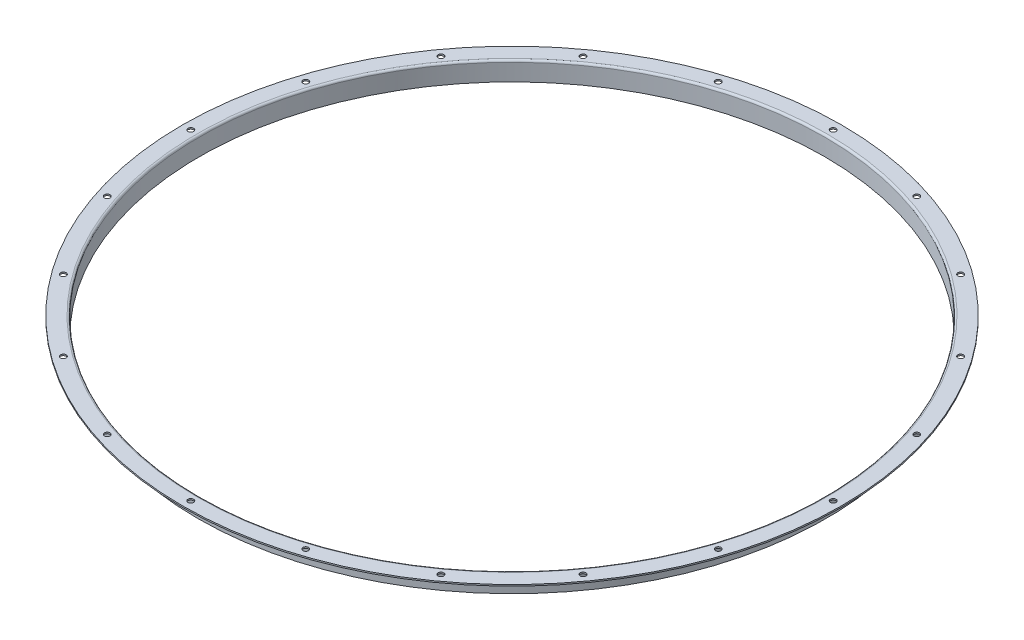
ISO-10303-21;
HEADER;
FILE_DESCRIPTION(('STEP AP214'),'2;1');
FILE_NAME('part.step','',(''),(''),'','','');
FILE_SCHEMA(('AUTOMOTIVE_DESIGN { 1 0 10303 214 1 1 1 1 }'));
ENDSEC;
DATA;
#1=APPLICATION_CONTEXT('core data for automotive mechanical design processes');
#2=APPLICATION_PROTOCOL_DEFINITION('international standard','automotive_design',2000,#1);
#3=PRODUCT_CONTEXT('',#1,'mechanical');
#4=PRODUCT('Part','Part','',(#3));
#5=PRODUCT_RELATED_PRODUCT_CATEGORY('part','',(#4));
#6=PRODUCT_DEFINITION_FORMATION('','',#4);
#7=PRODUCT_DEFINITION_CONTEXT('part definition',#1,'design');
#8=PRODUCT_DEFINITION('design','',#6,#7);
#9=PRODUCT_DEFINITION_SHAPE('','',#8);
#10=(LENGTH_UNIT() NAMED_UNIT(*) SI_UNIT(.MILLI.,.METRE.));
#11=(NAMED_UNIT(*) PLANE_ANGLE_UNIT() SI_UNIT($,.RADIAN.));
#12=(NAMED_UNIT(*) SI_UNIT($,.STERADIAN.) SOLID_ANGLE_UNIT());
#13=UNCERTAINTY_MEASURE_WITH_UNIT(LENGTH_MEASURE(1.E-05),#10,'distance_accuracy_value','');
#14=(GEOMETRIC_REPRESENTATION_CONTEXT(3) GLOBAL_UNCERTAINTY_ASSIGNED_CONTEXT((#13)) GLOBAL_UNIT_ASSIGNED_CONTEXT((#10,
#11,#12)) REPRESENTATION_CONTEXT('',''));
#15=CARTESIAN_POINT('',(0.,0.,0.));
#16=DIRECTION('',(0.,0.,1.));
#17=DIRECTION('',(1.,0.,0.));
#18=AXIS2_PLACEMENT_3D('',#15,#16,#17);
#19=CARTESIAN_POINT('',(0.,-2.5,0.));
#20=DIRECTION('',(0.,1.,0.));
#21=DIRECTION('',(0.,0.,1.));
#22=AXIS2_PLACEMENT_3D('',#19,#20,#21);
#23=PLANE('',#22);
#24=CARTESIAN_POINT('',(-567.499999999978,-2.5,3.22586402035085E-11));
#25=DIRECTION('',(0.,1.,0.));
#26=DIRECTION('',(0.,0.,1.));
#27=AXIS2_PLACEMENT_3D('',#24,#25,#26);
#28=CIRCLE('',#27,5.00000000005728);
#29=CARTESIAN_POINT('',(-567.499999999978,-2.5,5.00000000008954));
#30=VERTEX_POINT('',#29);
#31=EDGE_CURVE('E139',#30,#30,#28,.T.);
#32=ORIENTED_EDGE('',*,*,#31,.T.);
#33=EDGE_LOOP('',(#32));
#34=FACE_BOUND('',#33,.T.);
#35=CARTESIAN_POINT('',(-539.724572997467,-2.5,175.367144307813));
#36=DIRECTION('',(0.,1.,0.));
#37=DIRECTION('',(0.,0.,1.));
#38=AXIS2_PLACEMENT_3D('',#35,#36,#37);
#39=CIRCLE('',#38,5.00000000005728);
#40=CARTESIAN_POINT('',(-539.724572997467,-2.5,180.367144307871));
#41=VERTEX_POINT('',#40);
#42=EDGE_CURVE('E327',#41,#41,#39,.T.);
#43=ORIENTED_EDGE('',*,*,#42,.T.);
#44=EDGE_LOOP('',(#43));
#45=FACE_BOUND('',#44,.T.);
#46=CARTESIAN_POINT('',(-459.117144307741,-2.5,333.568130676005));
#47=DIRECTION('',(0.,1.,0.));
#48=DIRECTION('',(0.,0.,1.));
#49=AXIS2_PLACEMENT_3D('',#46,#47,#48);
#50=CIRCLE('',#49,5.00000000005729);
#51=CARTESIAN_POINT('',(-459.117144307741,-2.5,338.568130676062));
#52=VERTEX_POINT('',#51);
#53=EDGE_CURVE('E325',#52,#52,#50,.T.);
#54=ORIENTED_EDGE('',*,*,#53,.T.);
#55=EDGE_LOOP('',(#54));
#56=FACE_BOUND('',#55,.T.);
#57=CARTESIAN_POINT('',(-333.56813067593,-2.5,459.117144307802));
#58=DIRECTION('',(0.,1.,0.));
#59=DIRECTION('',(0.,0.,1.));
#60=AXIS2_PLACEMENT_3D('',#57,#58,#59);
#61=CIRCLE('',#60,5.00000000005729);
#62=CARTESIAN_POINT('',(-333.56813067593,-2.5,464.117144307859));
#63=VERTEX_POINT('',#62);
#64=EDGE_CURVE('E322',#63,#63,#61,.T.);
#65=ORIENTED_EDGE('',*,*,#64,.T.);
#66=EDGE_LOOP('',(#65));
#67=FACE_BOUND('',#66,.T.);
#68=CARTESIAN_POINT('',(-175.36714430773,-2.5,539.72457299751));
#69=DIRECTION('',(0.,1.,0.));
#70=DIRECTION('',(0.,0.,1.));
#71=AXIS2_PLACEMENT_3D('',#68,#69,#70);
#72=CIRCLE('',#71,5.00000000005729);
#73=CARTESIAN_POINT('',(-175.36714430773,-2.5,544.724572997567));
#74=VERTEX_POINT('',#73);
#75=EDGE_CURVE('E319',#74,#74,#72,.T.);
#76=ORIENTED_EDGE('',*,*,#75,.T.);
#77=EDGE_LOOP('',(#76));
#78=FACE_BOUND('',#77,.T.);
#79=CARTESIAN_POINT('',(5.45478212559115E-11,-2.5,567.5));
#80=DIRECTION('',(0.,1.,0.));
#81=DIRECTION('',(0.,0.,1.));
#82=AXIS2_PLACEMENT_3D('',#79,#80,#81);
#83=CIRCLE('',#82,5.00000000005729);
#84=CARTESIAN_POINT('',(5.45478212559115E-11,-2.5,572.500000000057));
#85=VERTEX_POINT('',#84);
#86=EDGE_CURVE('E316',#85,#85,#83,.T.);
#87=ORIENTED_EDGE('',*,*,#86,.T.);
#88=EDGE_LOOP('',(#87));
#89=FACE_BOUND('',#88,.T.);
#90=CARTESIAN_POINT('',(175.367144307836,-2.5,539.72457299749));
#91=DIRECTION('',(0.,1.,0.));
#92=DIRECTION('',(0.,0.,1.));
#93=AXIS2_PLACEMENT_3D('',#90,#91,#92);
#94=CIRCLE('',#93,5.00000000005729);
#95=CARTESIAN_POINT('',(175.367144307836,-2.5,544.724572997547));
#96=VERTEX_POINT('',#95);
#97=EDGE_CURVE('E313',#96,#96,#94,.T.);
#98=ORIENTED_EDGE('',*,*,#97,.T.);
#99=EDGE_LOOP('',(#98));
#100=FACE_BOUND('',#99,.T.);
#101=CARTESIAN_POINT('',(333.568130676027,-2.5,459.117144307764));
#102=DIRECTION('',(0.,1.,0.));
#103=DIRECTION('',(0.,0.,1.));
#104=AXIS2_PLACEMENT_3D('',#101,#102,#103);
#105=CIRCLE('',#104,5.00000000005729);
#106=CARTESIAN_POINT('',(333.568130676027,-2.5,464.117144307821));
#107=VERTEX_POINT('',#106);
#108=EDGE_CURVE('E310',#107,#107,#105,.T.);
#109=ORIENTED_EDGE('',*,*,#108,.T.);
#110=EDGE_LOOP('',(#109));
#111=FACE_BOUND('',#110,.T.);
#112=CARTESIAN_POINT('',(459.117144307824,-2.5,333.568130675953));
#113=DIRECTION('',(0.,1.,0.));
#114=DIRECTION('',(0.,0.,1.));
#115=AXIS2_PLACEMENT_3D('',#112,#113,#114);
#116=CIRCLE('',#115,5.00000000005729);
#117=CARTESIAN_POINT('',(459.117144307824,-2.5,338.56813067601));
#118=VERTEX_POINT('',#117);
#119=EDGE_CURVE('E307',#118,#118,#116,.T.);
#120=ORIENTED_EDGE('',*,*,#119,.T.);
#121=EDGE_LOOP('',(#120));
#122=FACE_BOUND('',#121,.T.);
#123=CARTESIAN_POINT('',(539.724572997532,-2.5,175.367144307752));
#124=DIRECTION('',(0.,1.,0.));
#125=DIRECTION('',(0.,0.,1.));
#126=AXIS2_PLACEMENT_3D('',#123,#124,#125);
#127=CIRCLE('',#126,5.00000000005728);
#128=CARTESIAN_POINT('',(539.724572997532,-2.5,180.367144307809));
#129=VERTEX_POINT('',#128);
#130=EDGE_CURVE('E304',#129,#129,#127,.T.);
#131=ORIENTED_EDGE('',*,*,#130,.T.);
#132=EDGE_LOOP('',(#131));
#133=FACE_BOUND('',#132,.T.);
#134=CARTESIAN_POINT('',(567.500000000022,-2.5,-3.21891414976569E-11));
#135=DIRECTION('',(0.,1.,0.));
#136=DIRECTION('',(0.,0.,1.));
#137=AXIS2_PLACEMENT_3D('',#134,#135,#136);
#138=CIRCLE('',#137,5.00000000005728);
#139=CARTESIAN_POINT('',(567.500000000022,-2.5,5.00000000002509));
#140=VERTEX_POINT('',#139);
#141=EDGE_CURVE('E301',#140,#140,#138,.T.);
#142=ORIENTED_EDGE('',*,*,#141,.T.);
#143=EDGE_LOOP('',(#142));
#144=FACE_BOUND('',#143,.T.);
#145=CARTESIAN_POINT('',(539.724572997512,-2.5,-175.367144307813));
#146=DIRECTION('',(0.,1.,0.));
#147=DIRECTION('',(0.,0.,1.));
#148=AXIS2_PLACEMENT_3D('',#145,#146,#147);
#149=CIRCLE('',#148,5.00000000005728);
#150=CARTESIAN_POINT('',(539.724572997512,-2.5,-170.367144307756));
#151=VERTEX_POINT('',#150);
#152=EDGE_CURVE('E298',#151,#151,#149,.T.);
#153=ORIENTED_EDGE('',*,*,#152,.T.);
#154=EDGE_LOOP('',(#153));
#155=FACE_BOUND('',#154,.T.);
#156=CARTESIAN_POINT('',(175.367144307774,-2.5,-539.72457299751));
#157=DIRECTION('',(0.,1.,0.));
#158=DIRECTION('',(0.,0.,1.));
#159=AXIS2_PLACEMENT_3D('',#156,#157,#158);
#160=CIRCLE('',#159,5.00000000005729);
#161=CARTESIAN_POINT('',(175.367144307774,-2.5,-534.724572997452));
#162=VERTEX_POINT('',#161);
#163=EDGE_CURVE('E295',#162,#162,#160,.T.);
#164=ORIENTED_EDGE('',*,*,#163,.T.);
#165=EDGE_LOOP('',(#164));
#166=FACE_BOUND('',#165,.T.);
#167=CARTESIAN_POINT('',(333.568130675975,-2.5,-459.117144307802));
#168=DIRECTION('',(0.,1.,0.));
#169=DIRECTION('',(0.,0.,1.));
#170=AXIS2_PLACEMENT_3D('',#167,#168,#169);
#171=CIRCLE('',#170,5.00000000005729);
#172=CARTESIAN_POINT('',(333.568130675975,-2.5,-454.117144307744));
#173=VERTEX_POINT('',#172);
#174=EDGE_CURVE('E292',#173,#173,#171,.T.);
#175=ORIENTED_EDGE('',*,*,#174,.T.);
#176=EDGE_LOOP('',(#175));
#177=FACE_BOUND('',#176,.T.);
#178=CARTESIAN_POINT('',(-9.83046173940238E-12,-2.5,-567.5));
#179=DIRECTION('',(0.,1.,0.));
#180=DIRECTION('',(0.,0.,1.));
#181=AXIS2_PLACEMENT_3D('',#178,#179,#180);
#182=CIRCLE('',#181,5.00000000005729);
#183=CARTESIAN_POINT('',(-9.83046173940238E-12,-2.5,-562.499999999943));
#184=VERTEX_POINT('',#183);
#185=EDGE_CURVE('E283',#184,#184,#182,.T.);
#186=ORIENTED_EDGE('',*,*,#185,.T.);
#187=EDGE_LOOP('',(#186));
#188=FACE_BOUND('',#187,.T.);
#189=CARTESIAN_POINT('',(459.117144307786,-2.5,-333.568130676005));
#190=DIRECTION('',(0.,1.,0.));
#191=DIRECTION('',(0.,0.,1.));
#192=AXIS2_PLACEMENT_3D('',#189,#190,#191);
#193=CIRCLE('',#192,5.00000000005729);
#194=CARTESIAN_POINT('',(459.117144307786,-2.5,-328.568130675947));
#195=VERTEX_POINT('',#194);
#196=EDGE_CURVE('E279',#195,#195,#193,.T.);
#197=ORIENTED_EDGE('',*,*,#196,.T.);
#198=EDGE_LOOP('',(#197));
#199=FACE_BOUND('',#198,.T.);
#200=CARTESIAN_POINT('',(-459.117144307779,-2.5,-333.568130675952));
#201=DIRECTION('',(0.,1.,0.));
#202=DIRECTION('',(0.,0.,1.));
#203=AXIS2_PLACEMENT_3D('',#200,#201,#202);
#204=CIRCLE('',#203,5.00000000005729);
#205=CARTESIAN_POINT('',(-459.117144307779,-2.5,-328.568130675895));
#206=VERTEX_POINT('',#205);
#207=EDGE_CURVE('E277',#206,#206,#204,.T.);
#208=ORIENTED_EDGE('',*,*,#207,.T.);
#209=EDGE_LOOP('',(#208));
#210=FACE_BOUND('',#209,.T.);
#211=CARTESIAN_POINT('',(-333.568130675982,-2.5,-459.117144307764));
#212=DIRECTION('',(0.,1.,0.));
#213=DIRECTION('',(0.,0.,1.));
#214=AXIS2_PLACEMENT_3D('',#211,#212,#213);
#215=CIRCLE('',#214,5.00000000005729);
#216=CARTESIAN_POINT('',(-333.568130675982,-2.5,-454.117144307706));
#217=VERTEX_POINT('',#216);
#218=EDGE_CURVE('E280',#217,#217,#215,.T.);
#219=ORIENTED_EDGE('',*,*,#218,.T.);
#220=EDGE_LOOP('',(#219));
#221=FACE_BOUND('',#220,.T.);
#222=CARTESIAN_POINT('',(-175.367144307791,-2.5,-539.72457299749));
#223=DIRECTION('',(0.,1.,0.));
#224=DIRECTION('',(0.,0.,1.));
#225=AXIS2_PLACEMENT_3D('',#222,#223,#224);
#226=CIRCLE('',#225,5.00000000005729);
#227=CARTESIAN_POINT('',(-175.367144307791,-2.5,-534.724572997432));
#228=VERTEX_POINT('',#227);
#229=EDGE_CURVE('E286',#228,#228,#226,.T.);
#230=ORIENTED_EDGE('',*,*,#229,.T.);
#231=EDGE_LOOP('',(#230));
#232=FACE_BOUND('',#231,.T.);
#233=CARTESIAN_POINT('',(-539.724572997487,-2.5,-175.367144307752));
#234=DIRECTION('',(0.,1.,0.));
#235=DIRECTION('',(0.,0.,1.));
#236=AXIS2_PLACEMENT_3D('',#233,#234,#235);
#237=CIRCLE('',#236,5.00000000005926);
#238=CARTESIAN_POINT('',(-539.724572997487,-2.5,-170.367144307693));
#239=VERTEX_POINT('',#238);
#240=EDGE_CURVE('E370',#239,#239,#237,.T.);
#241=ORIENTED_EDGE('',*,*,#240,.T.);
#242=EDGE_LOOP('',(#241));
#243=FACE_BOUND('',#242,.T.);
#244=CARTESIAN_POINT('',(0.,-2.5,0.));
#245=DIRECTION('',(0.,1.,0.));
#246=DIRECTION('',(0.,0.,1.));
#247=AXIS2_PLACEMENT_3D('',#244,#245,#246);
#248=CIRCLE('',#247,582.5);
#249=CARTESIAN_POINT('',(0.,-2.5,582.5));
#250=VERTEX_POINT('',#249);
#251=EDGE_CURVE('E96',#250,#250,#248,.T.);
#252=ORIENTED_EDGE('',*,*,#251,.F.);
#253=EDGE_LOOP('',(#252));
#254=FACE_BOUND('',#253,.T.);
#255=CARTESIAN_POINT('',(0.,-2.5,0.));
#256=DIRECTION('',(0.,1.,0.));
#257=DIRECTION('',(0.,0.,1.));
#258=AXIS2_PLACEMENT_3D('',#255,#256,#257);
#259=CIRCLE('',#258,556.);
#260=CARTESIAN_POINT('',(0.,-2.5,556.));
#261=VERTEX_POINT('',#260);
#262=EDGE_CURVE('E12',#261,#261,#259,.F.);
#263=ORIENTED_EDGE('',*,*,#262,.F.);
#264=EDGE_LOOP('',(#263));
#265=FACE_BOUND('',#264,.T.);
#266=ADVANCED_FACE('F88',(#34,#45,#56,#67,#78,#89,#100,#111,#122,#133,#144,#155,#166,#177,#188,
#199,#210,#221,#232,#243,#254,#265),#23,.F.);
#267=CARTESIAN_POINT('',(0.,0.,0.));
#268=DIRECTION('',(0.,1.,0.));
#269=DIRECTION('',(0.,0.,1.));
#270=AXIS2_PLACEMENT_3D('',#267,#268,#269);
#271=PLANE('',#270);
#272=CARTESIAN_POINT('',(-567.499999999978,0.,3.22586402035085E-11));
#273=DIRECTION('',(0.,1.,0.));
#274=DIRECTION('',(0.,0.,1.));
#275=AXIS2_PLACEMENT_3D('',#272,#273,#274);
#276=CIRCLE('',#275,5.00000000005728);
#277=CARTESIAN_POINT('',(-567.499999999978,0.,5.00000000008954));
#278=VERTEX_POINT('',#277);
#279=EDGE_CURVE('E403',#278,#278,#276,.T.);
#280=ORIENTED_EDGE('',*,*,#279,.F.);
#281=EDGE_LOOP('',(#280));
#282=FACE_BOUND('',#281,.T.);
#283=CARTESIAN_POINT('',(-539.724572997467,0.,175.367144307813));
#284=DIRECTION('',(0.,1.,0.));
#285=DIRECTION('',(0.,0.,1.));
#286=AXIS2_PLACEMENT_3D('',#283,#284,#285);
#287=CIRCLE('',#286,5.00000000005728);
#288=CARTESIAN_POINT('',(-539.724572997467,0.,180.367144307871));
#289=VERTEX_POINT('',#288);
#290=EDGE_CURVE('E406',#289,#289,#287,.T.);
#291=ORIENTED_EDGE('',*,*,#290,.F.);
#292=EDGE_LOOP('',(#291));
#293=FACE_BOUND('',#292,.T.);
#294=CARTESIAN_POINT('',(-459.117144307741,0.,333.568130676005));
#295=DIRECTION('',(0.,1.,0.));
#296=DIRECTION('',(0.,0.,1.));
#297=AXIS2_PLACEMENT_3D('',#294,#295,#296);
#298=CIRCLE('',#297,5.00000000005729);
#299=CARTESIAN_POINT('',(-459.117144307741,0.,338.568130676062));
#300=VERTEX_POINT('',#299);
#301=EDGE_CURVE('E409',#300,#300,#298,.T.);
#302=ORIENTED_EDGE('',*,*,#301,.F.);
#303=EDGE_LOOP('',(#302));
#304=FACE_BOUND('',#303,.T.);
#305=CARTESIAN_POINT('',(-333.56813067593,0.,459.117144307802));
#306=DIRECTION('',(0.,1.,0.));
#307=DIRECTION('',(0.,0.,1.));
#308=AXIS2_PLACEMENT_3D('',#305,#306,#307);
#309=CIRCLE('',#308,5.00000000005729);
#310=CARTESIAN_POINT('',(-333.56813067593,0.,464.117144307859));
#311=VERTEX_POINT('',#310);
#312=EDGE_CURVE('E412',#311,#311,#309,.T.);
#313=ORIENTED_EDGE('',*,*,#312,.F.);
#314=EDGE_LOOP('',(#313));
#315=FACE_BOUND('',#314,.T.);
#316=CARTESIAN_POINT('',(-175.36714430773,0.,539.72457299751));
#317=DIRECTION('',(0.,1.,0.));
#318=DIRECTION('',(0.,0.,1.));
#319=AXIS2_PLACEMENT_3D('',#316,#317,#318);
#320=CIRCLE('',#319,5.00000000005729);
#321=CARTESIAN_POINT('',(-175.36714430773,0.,544.724572997567));
#322=VERTEX_POINT('',#321);
#323=EDGE_CURVE('E415',#322,#322,#320,.T.);
#324=ORIENTED_EDGE('',*,*,#323,.F.);
#325=EDGE_LOOP('',(#324));
#326=FACE_BOUND('',#325,.T.);
#327=CARTESIAN_POINT('',(5.45478212559115E-11,0.,567.5));
#328=DIRECTION('',(0.,1.,0.));
#329=DIRECTION('',(0.,0.,1.));
#330=AXIS2_PLACEMENT_3D('',#327,#328,#329);
#331=CIRCLE('',#330,5.00000000005729);
#332=CARTESIAN_POINT('',(5.45478212559115E-11,0.,572.500000000057));
#333=VERTEX_POINT('',#332);
#334=EDGE_CURVE('E418',#333,#333,#331,.T.);
#335=ORIENTED_EDGE('',*,*,#334,.F.);
#336=EDGE_LOOP('',(#335));
#337=FACE_BOUND('',#336,.T.);
#338=CARTESIAN_POINT('',(175.367144307836,0.,539.72457299749));
#339=DIRECTION('',(0.,1.,0.));
#340=DIRECTION('',(0.,0.,1.));
#341=AXIS2_PLACEMENT_3D('',#338,#339,#340);
#342=CIRCLE('',#341,5.00000000005729);
#343=CARTESIAN_POINT('',(175.367144307836,0.,544.724572997547));
#344=VERTEX_POINT('',#343);
#345=EDGE_CURVE('E421',#344,#344,#342,.T.);
#346=ORIENTED_EDGE('',*,*,#345,.F.);
#347=EDGE_LOOP('',(#346));
#348=FACE_BOUND('',#347,.T.);
#349=CARTESIAN_POINT('',(333.568130676027,0.,459.117144307764));
#350=DIRECTION('',(0.,1.,0.));
#351=DIRECTION('',(0.,0.,1.));
#352=AXIS2_PLACEMENT_3D('',#349,#350,#351);
#353=CIRCLE('',#352,5.00000000005729);
#354=CARTESIAN_POINT('',(333.568130676027,0.,464.117144307821));
#355=VERTEX_POINT('',#354);
#356=EDGE_CURVE('E383',#355,#355,#353,.T.);
#357=ORIENTED_EDGE('',*,*,#356,.F.);
#358=EDGE_LOOP('',(#357));
#359=FACE_BOUND('',#358,.T.);
#360=CARTESIAN_POINT('',(459.117144307824,0.,333.568130675953));
#361=DIRECTION('',(0.,1.,0.));
#362=DIRECTION('',(0.,0.,1.));
#363=AXIS2_PLACEMENT_3D('',#360,#361,#362);
#364=CIRCLE('',#363,5.00000000005729);
#365=CARTESIAN_POINT('',(459.117144307824,0.,338.56813067601));
#366=VERTEX_POINT('',#365);
#367=EDGE_CURVE('E379',#366,#366,#364,.T.);
#368=ORIENTED_EDGE('',*,*,#367,.F.);
#369=EDGE_LOOP('',(#368));
#370=FACE_BOUND('',#369,.T.);
#371=CARTESIAN_POINT('',(539.724572997532,0.,175.367144307752));
#372=DIRECTION('',(0.,1.,0.));
#373=DIRECTION('',(0.,0.,1.));
#374=AXIS2_PLACEMENT_3D('',#371,#372,#373);
#375=CIRCLE('',#374,5.00000000005728);
#376=CARTESIAN_POINT('',(539.724572997532,0.,180.367144307809));
#377=VERTEX_POINT('',#376);
#378=EDGE_CURVE('E382',#377,#377,#375,.T.);
#379=ORIENTED_EDGE('',*,*,#378,.F.);
#380=EDGE_LOOP('',(#379));
#381=FACE_BOUND('',#380,.T.);
#382=CARTESIAN_POINT('',(567.500000000022,0.,-3.21891414976569E-11));
#383=DIRECTION('',(0.,1.,0.));
#384=DIRECTION('',(0.,0.,1.));
#385=AXIS2_PLACEMENT_3D('',#382,#383,#384);
#386=CIRCLE('',#385,5.00000000005728);
#387=CARTESIAN_POINT('',(567.500000000022,0.,5.00000000002509));
#388=VERTEX_POINT('',#387);
#389=EDGE_CURVE('E386',#388,#388,#386,.T.);
#390=ORIENTED_EDGE('',*,*,#389,.F.);
#391=EDGE_LOOP('',(#390));
#392=FACE_BOUND('',#391,.T.);
#393=CARTESIAN_POINT('',(539.724572997512,0.,-175.367144307813));
#394=DIRECTION('',(0.,1.,0.));
#395=DIRECTION('',(0.,0.,1.));
#396=AXIS2_PLACEMENT_3D('',#393,#394,#395);
#397=CIRCLE('',#396,5.00000000005728);
#398=CARTESIAN_POINT('',(539.724572997512,0.,-170.367144307756));
#399=VERTEX_POINT('',#398);
#400=EDGE_CURVE('E389',#399,#399,#397,.T.);
#401=ORIENTED_EDGE('',*,*,#400,.F.);
#402=EDGE_LOOP('',(#401));
#403=FACE_BOUND('',#402,.T.);
#404=CARTESIAN_POINT('',(175.367144307774,0.,-539.72457299751));
#405=DIRECTION('',(0.,1.,0.));
#406=DIRECTION('',(0.,0.,1.));
#407=AXIS2_PLACEMENT_3D('',#404,#405,#406);
#408=CIRCLE('',#407,5.00000000005729);
#409=CARTESIAN_POINT('',(175.367144307774,0.,-534.724572997452));
#410=VERTEX_POINT('',#409);
#411=EDGE_CURVE('E376',#410,#410,#408,.T.);
#412=ORIENTED_EDGE('',*,*,#411,.F.);
#413=EDGE_LOOP('',(#412));
#414=FACE_BOUND('',#413,.T.);
#415=CARTESIAN_POINT('',(333.568130675975,0.,-459.117144307802));
#416=DIRECTION('',(0.,1.,0.));
#417=DIRECTION('',(0.,0.,1.));
#418=AXIS2_PLACEMENT_3D('',#415,#416,#417);
#419=CIRCLE('',#418,5.00000000005729);
#420=CARTESIAN_POINT('',(333.568130675975,0.,-454.117144307744));
#421=VERTEX_POINT('',#420);
#422=EDGE_CURVE('E393',#421,#421,#419,.T.);
#423=ORIENTED_EDGE('',*,*,#422,.F.);
#424=EDGE_LOOP('',(#423));
#425=FACE_BOUND('',#424,.T.);
#426=CARTESIAN_POINT('',(-9.83046173940238E-12,0.,-567.5));
#427=DIRECTION('',(0.,1.,0.));
#428=DIRECTION('',(0.,0.,1.));
#429=AXIS2_PLACEMENT_3D('',#426,#427,#428);
#430=CIRCLE('',#429,5.00000000005729);
#431=CARTESIAN_POINT('',(-9.83046173940238E-12,0.,-562.499999999943));
#432=VERTEX_POINT('',#431);
#433=EDGE_CURVE('E396',#432,#432,#430,.T.);
#434=ORIENTED_EDGE('',*,*,#433,.F.);
#435=EDGE_LOOP('',(#434));
#436=FACE_BOUND('',#435,.T.);
#437=CARTESIAN_POINT('',(459.117144307786,0.,-333.568130676005));
#438=DIRECTION('',(0.,1.,0.));
#439=DIRECTION('',(0.,0.,1.));
#440=AXIS2_PLACEMENT_3D('',#437,#438,#439);
#441=CIRCLE('',#440,5.00000000005729);
#442=CARTESIAN_POINT('',(459.117144307786,0.,-328.568130675947));
#443=VERTEX_POINT('',#442);
#444=EDGE_CURVE('E392',#443,#443,#441,.T.);
#445=ORIENTED_EDGE('',*,*,#444,.F.);
#446=EDGE_LOOP('',(#445));
#447=FACE_BOUND('',#446,.T.);
#448=CARTESIAN_POINT('',(-459.117144307779,0.,-333.568130675952));
#449=DIRECTION('',(0.,1.,0.));
#450=DIRECTION('',(0.,0.,1.));
#451=AXIS2_PLACEMENT_3D('',#448,#449,#450);
#452=CIRCLE('',#451,5.00000000005729);
#453=CARTESIAN_POINT('',(-459.117144307779,0.,-328.568130675895));
#454=VERTEX_POINT('',#453);
#455=EDGE_CURVE('E274',#454,#454,#452,.T.);
#456=ORIENTED_EDGE('',*,*,#455,.F.);
#457=EDGE_LOOP('',(#456));
#458=FACE_BOUND('',#457,.T.);
#459=CARTESIAN_POINT('',(-333.568130675982,0.,-459.117144307764));
#460=DIRECTION('',(0.,1.,0.));
#461=DIRECTION('',(0.,0.,1.));
#462=AXIS2_PLACEMENT_3D('',#459,#460,#461);
#463=CIRCLE('',#462,5.00000000005729);
#464=CARTESIAN_POINT('',(-333.568130675982,0.,-454.117144307706));
#465=VERTEX_POINT('',#464);
#466=EDGE_CURVE('E429',#465,#465,#463,.T.);
#467=ORIENTED_EDGE('',*,*,#466,.F.);
#468=EDGE_LOOP('',(#467));
#469=FACE_BOUND('',#468,.T.);
#470=CARTESIAN_POINT('',(-175.367144307791,0.,-539.72457299749));
#471=DIRECTION('',(0.,1.,0.));
#472=DIRECTION('',(0.,0.,1.));
#473=AXIS2_PLACEMENT_3D('',#470,#471,#472);
#474=CIRCLE('',#473,5.00000000005729);
#475=CARTESIAN_POINT('',(-175.367144307791,0.,-534.724572997432));
#476=VERTEX_POINT('',#475);
#477=EDGE_CURVE('E426',#476,#476,#474,.T.);
#478=ORIENTED_EDGE('',*,*,#477,.F.);
#479=EDGE_LOOP('',(#478));
#480=FACE_BOUND('',#479,.T.);
#481=CARTESIAN_POINT('',(-539.724572997487,0.,-175.367144307752));
#482=DIRECTION('',(0.,1.,0.));
#483=DIRECTION('',(0.,0.,1.));
#484=AXIS2_PLACEMENT_3D('',#481,#482,#483);
#485=CIRCLE('',#484,5.00000000005926);
#486=CARTESIAN_POINT('',(-539.724572997487,0.,-170.367144307693));
#487=VERTEX_POINT('',#486);
#488=EDGE_CURVE('E373',#487,#487,#485,.T.);
#489=ORIENTED_EDGE('',*,*,#488,.F.);
#490=EDGE_LOOP('',(#489));
#491=FACE_BOUND('',#490,.T.);
#492=CARTESIAN_POINT('',(0.,0.,0.));
#493=DIRECTION('',(0.,1.,0.));
#494=DIRECTION('',(0.,0.,1.));
#495=AXIS2_PLACEMENT_3D('',#492,#493,#494);
#496=CIRCLE('',#495,582.5);
#497=CARTESIAN_POINT('',(0.,0.,582.5));
#498=VERTEX_POINT('',#497);
#499=EDGE_CURVE('E152',#498,#498,#496,.T.);
#500=ORIENTED_EDGE('',*,*,#499,.T.);
#501=EDGE_LOOP('',(#500));
#502=FACE_BOUND('',#501,.T.);
#503=CARTESIAN_POINT('',(0.,0.,0.));
#504=DIRECTION('',(0.,1.,0.));
#505=DIRECTION('',(0.,0.,1.));
#506=AXIS2_PLACEMENT_3D('',#503,#504,#505);
#507=CIRCLE('',#506,556.);
#508=CARTESIAN_POINT('',(0.,0.,556.));
#509=VERTEX_POINT('',#508);
#510=EDGE_CURVE('E103',#509,#509,#507,.T.);
#511=ORIENTED_EDGE('',*,*,#510,.F.);
#512=EDGE_LOOP('',(#511));
#513=FACE_BOUND('',#512,.T.);
#514=ADVANCED_FACE('F157',(#282,#293,#304,#315,#326,#337,#348,#359,#370,#381,#392,#403,#414,
#425,#436,#447,#458,#469,#480,#491,#502,#513),#271,.T.);
#515=CARTESIAN_POINT('',(0.,-2.5,0.));
#516=DIRECTION('',(0.,1.,0.));
#517=DIRECTION('',(0.,0.,1.));
#518=AXIS2_PLACEMENT_3D('',#515,#516,#517);
#519=CYLINDRICAL_SURFACE('',#518,582.5);
#520=ORIENTED_EDGE('',*,*,#251,.T.);
#521=EDGE_LOOP('',(#520));
#522=FACE_BOUND('',#521,.T.);
#523=ORIENTED_EDGE('',*,*,#499,.F.);
#524=EDGE_LOOP('',(#523));
#525=FACE_BOUND('',#524,.T.);
#526=ADVANCED_FACE('F90',(#522,#525),#519,.T.);
#527=CARTESIAN_POINT('',(0.,-33.5,0.));
#528=DIRECTION('',(0.,-1.,0.));
#529=DIRECTION('',(0.,0.,-1.));
#530=AXIS2_PLACEMENT_3D('',#527,#528,#529);
#531=PLANE('',#530);
#532=CARTESIAN_POINT('',(0.,-33.5,0.));
#533=DIRECTION('',(0.,1.,0.));
#534=DIRECTION('',(0.,0.,1.));
#535=AXIS2_PLACEMENT_3D('',#532,#533,#534);
#536=CIRCLE('',#535,552.5);
#537=CARTESIAN_POINT('',(0.,-33.5,552.5));
#538=VERTEX_POINT('',#537);
#539=EDGE_CURVE('E131',#538,#538,#536,.T.);
#540=ORIENTED_EDGE('',*,*,#539,.T.);
#541=EDGE_LOOP('',(#540));
#542=FACE_BOUND('',#541,.T.);
#543=CARTESIAN_POINT('',(0.,-33.5,0.));
#544=DIRECTION('',(0.,1.,0.));
#545=DIRECTION('',(0.,0.,1.));
#546=AXIS2_PLACEMENT_3D('',#543,#544,#545);
#547=CIRCLE('',#546,555.);
#548=CARTESIAN_POINT('',(0.,-33.5,555.));
#549=VERTEX_POINT('',#548);
#550=EDGE_CURVE('E141',#549,#549,#547,.T.);
#551=ORIENTED_EDGE('',*,*,#550,.F.);
#552=EDGE_LOOP('',(#551));
#553=FACE_BOUND('',#552,.T.);
#554=ADVANCED_FACE('F161',(#542,#553),#531,.T.);
#555=CARTESIAN_POINT('',(0.,-2.5,0.));
#556=DIRECTION('',(0.,1.,0.));
#557=DIRECTION('',(0.,0.,1.));
#558=AXIS2_PLACEMENT_3D('',#555,#556,#557);
#559=CYLINDRICAL_SURFACE('',#558,555.);
#560=DIRECTION('',(0.,-1.,0.));
#561=VECTOR('',#560,1.);
#562=CARTESIAN_POINT('',(0.,-2.5,555.));
#563=LINE('',#562,#561);
#564=CARTESIAN_POINT('',(0.,-3.5,555.));
#565=VERTEX_POINT('',#564);
#566=EDGE_CURVE('E130',#565,#549,#563,.T.);
#567=ORIENTED_EDGE('',*,*,#566,.F.);
#568=CARTESIAN_POINT('',(0.,-3.5,0.));
#569=DIRECTION('',(0.,1.,0.));
#570=DIRECTION('',(0.,0.,1.));
#571=AXIS2_PLACEMENT_3D('',#568,#569,#570);
#572=CIRCLE('',#571,555.);
#573=EDGE_CURVE('E129',#565,#565,#572,.T.);
#574=ORIENTED_EDGE('',*,*,#573,.F.);
#575=ORIENTED_EDGE('',*,*,#566,.T.);
#576=ORIENTED_EDGE('',*,*,#550,.T.);
#577=EDGE_LOOP('',(#567,#574,#575,#576));
#578=FACE_BOUND('',#577,.T.);
#579=ADVANCED_FACE('F167',(#578),#559,.T.);
#580=CARTESIAN_POINT('',(0.,-3.5,0.));
#581=DIRECTION('',(0.,1.,0.));
#582=DIRECTION('',(0.,0.,1.));
#583=AXIS2_PLACEMENT_3D('',#580,#581,#582);
#584=TOROIDAL_SURFACE('',#583,556.,1.);
#585=CARTESIAN_POINT('',(0.,-3.5,556.));
#586=DIRECTION('',(1.,0.,0.));
#587=DIRECTION('',(0.,1.,0.));
#588=AXIS2_PLACEMENT_3D('',#585,#586,#587);
#589=CIRCLE('',#588,1.);
#590=EDGE_CURVE('E127',#261,#565,#589,.F.);
#591=ORIENTED_EDGE('',*,*,#590,.F.);
#592=ORIENTED_EDGE('',*,*,#262,.T.);
#593=ORIENTED_EDGE('',*,*,#590,.T.);
#594=ORIENTED_EDGE('',*,*,#573,.T.);
#595=EDGE_LOOP('',(#591,#592,#593,#594));
#596=FACE_BOUND('',#595,.T.);
#597=ADVANCED_FACE('F126',(#596),#584,.F.);
#598=CARTESIAN_POINT('',(0.,-2.5,0.));
#599=DIRECTION('',(0.,1.,0.));
#600=DIRECTION('',(0.,0.,1.));
#601=AXIS2_PLACEMENT_3D('',#598,#599,#600);
#602=CYLINDRICAL_SURFACE('',#601,552.5);
#603=DIRECTION('',(0.,1.,0.));
#604=VECTOR('',#603,1.);
#605=CARTESIAN_POINT('',(0.,-2.5,552.5));
#606=LINE('',#605,#604);
#607=CARTESIAN_POINT('',(0.,-3.50000000000001,552.5));
#608=VERTEX_POINT('',#607);
#609=EDGE_CURVE('E144',#608,#538,#606,.F.);
#610=ORIENTED_EDGE('',*,*,#609,.T.);
#611=ORIENTED_EDGE('',*,*,#539,.F.);
#612=ORIENTED_EDGE('',*,*,#609,.F.);
#613=CARTESIAN_POINT('',(0.,-3.50000000000001,0.));
#614=DIRECTION('',(0.,1.,0.));
#615=DIRECTION('',(0.,0.,1.));
#616=AXIS2_PLACEMENT_3D('',#613,#614,#615);
#617=CIRCLE('',#616,552.5);
#618=EDGE_CURVE('E135',#608,#608,#617,.T.);
#619=ORIENTED_EDGE('',*,*,#618,.T.);
#620=EDGE_LOOP('',(#610,#611,#612,#619));
#621=FACE_BOUND('',#620,.T.);
#622=ADVANCED_FACE('F182',(#621),#602,.F.);
#623=CARTESIAN_POINT('',(0.,-3.5,0.));
#624=DIRECTION('',(0.,1.,0.));
#625=DIRECTION('',(0.,0.,1.));
#626=AXIS2_PLACEMENT_3D('',#623,#624,#625);
#627=TOROIDAL_SURFACE('',#626,556.,3.5);
#628=CARTESIAN_POINT('',(0.,-3.5,556.));
#629=DIRECTION('',(-1.,0.,0.));
#630=DIRECTION('',(0.,0.,1.));
#631=AXIS2_PLACEMENT_3D('',#628,#629,#630);
#632=CIRCLE('',#631,3.5);
#633=EDGE_CURVE('E146',#509,#608,#632,.T.);
#634=ORIENTED_EDGE('',*,*,#633,.T.);
#635=ORIENTED_EDGE('',*,*,#618,.F.);
#636=ORIENTED_EDGE('',*,*,#633,.F.);
#637=ORIENTED_EDGE('',*,*,#510,.T.);
#638=EDGE_LOOP('',(#634,#635,#636,#637));
#639=FACE_BOUND('',#638,.T.);
#640=ADVANCED_FACE('F178',(#639),#627,.T.);
#641=CARTESIAN_POINT('',(-539.724572997487,-10.,-175.367144307752));
#642=DIRECTION('',(0.,1.,0.));
#643=DIRECTION('',(0.,0.,1.));
#644=AXIS2_PLACEMENT_3D('',#641,#642,#643);
#645=CYLINDRICAL_SURFACE('',#644,5.00000000005926);
#646=ORIENTED_EDGE('',*,*,#488,.T.);
#647=EDGE_LOOP('',(#646));
#648=FACE_BOUND('',#647,.T.);
#649=ORIENTED_EDGE('',*,*,#240,.F.);
#650=EDGE_LOOP('',(#649));
#651=FACE_BOUND('',#650,.T.);
#652=ADVANCED_FACE('F181',(#648,#651),#645,.F.);
#653=CARTESIAN_POINT('',(-175.367144307791,-10.,-539.72457299749));
#654=DIRECTION('',(0.,1.,0.));
#655=DIRECTION('',(0.,0.,1.));
#656=AXIS2_PLACEMENT_3D('',#653,#654,#655);
#657=CYLINDRICAL_SURFACE('',#656,5.00000000005729);
#658=ORIENTED_EDGE('',*,*,#477,.T.);
#659=EDGE_LOOP('',(#658));
#660=FACE_BOUND('',#659,.T.);
#661=ORIENTED_EDGE('',*,*,#229,.F.);
#662=EDGE_LOOP('',(#661));
#663=FACE_BOUND('',#662,.T.);
#664=ADVANCED_FACE('F193',(#660,#663),#657,.F.);
#665=CARTESIAN_POINT('',(-333.568130675982,-10.,-459.117144307764));
#666=DIRECTION('',(0.,1.,0.));
#667=DIRECTION('',(0.,0.,1.));
#668=AXIS2_PLACEMENT_3D('',#665,#666,#667);
#669=CYLINDRICAL_SURFACE('',#668,5.00000000005729);
#670=ORIENTED_EDGE('',*,*,#466,.T.);
#671=EDGE_LOOP('',(#670));
#672=FACE_BOUND('',#671,.T.);
#673=ORIENTED_EDGE('',*,*,#218,.F.);
#674=EDGE_LOOP('',(#673));
#675=FACE_BOUND('',#674,.T.);
#676=ADVANCED_FACE('F262',(#672,#675),#669,.F.);
#677=CARTESIAN_POINT('',(-459.117144307779,-10.,-333.568130675952));
#678=DIRECTION('',(0.,1.,0.));
#679=DIRECTION('',(0.,0.,1.));
#680=AXIS2_PLACEMENT_3D('',#677,#678,#679);
#681=CYLINDRICAL_SURFACE('',#680,5.00000000005729);
#682=ORIENTED_EDGE('',*,*,#455,.T.);
#683=EDGE_LOOP('',(#682));
#684=FACE_BOUND('',#683,.T.);
#685=ORIENTED_EDGE('',*,*,#207,.F.);
#686=EDGE_LOOP('',(#685));
#687=FACE_BOUND('',#686,.T.);
#688=ADVANCED_FACE('F224',(#684,#687),#681,.F.);
#689=CARTESIAN_POINT('',(459.117144307786,-10.,-333.568130676005));
#690=DIRECTION('',(0.,1.,0.));
#691=DIRECTION('',(0.,0.,1.));
#692=AXIS2_PLACEMENT_3D('',#689,#690,#691);
#693=CYLINDRICAL_SURFACE('',#692,5.00000000005729);
#694=ORIENTED_EDGE('',*,*,#444,.T.);
#695=EDGE_LOOP('',(#694));
#696=FACE_BOUND('',#695,.T.);
#697=ORIENTED_EDGE('',*,*,#196,.F.);
#698=EDGE_LOOP('',(#697));
#699=FACE_BOUND('',#698,.T.);
#700=ADVANCED_FACE('F221',(#696,#699),#693,.F.);
#701=CARTESIAN_POINT('',(-9.83046173940238E-12,-10.,-567.5));
#702=DIRECTION('',(0.,1.,0.));
#703=DIRECTION('',(0.,0.,1.));
#704=AXIS2_PLACEMENT_3D('',#701,#702,#703);
#705=CYLINDRICAL_SURFACE('',#704,5.00000000005729);
#706=ORIENTED_EDGE('',*,*,#433,.T.);
#707=EDGE_LOOP('',(#706));
#708=FACE_BOUND('',#707,.T.);
#709=ORIENTED_EDGE('',*,*,#185,.F.);
#710=EDGE_LOOP('',(#709));
#711=FACE_BOUND('',#710,.T.);
#712=ADVANCED_FACE('F216',(#708,#711),#705,.F.);
#713=CARTESIAN_POINT('',(333.568130675975,-10.,-459.117144307802));
#714=DIRECTION('',(0.,1.,0.));
#715=DIRECTION('',(0.,0.,1.));
#716=AXIS2_PLACEMENT_3D('',#713,#714,#715);
#717=CYLINDRICAL_SURFACE('',#716,5.00000000005729);
#718=ORIENTED_EDGE('',*,*,#422,.T.);
#719=EDGE_LOOP('',(#718));
#720=FACE_BOUND('',#719,.T.);
#721=ORIENTED_EDGE('',*,*,#174,.F.);
#722=EDGE_LOOP('',(#721));
#723=FACE_BOUND('',#722,.T.);
#724=ADVANCED_FACE('F213',(#720,#723),#717,.F.);
#725=CARTESIAN_POINT('',(175.367144307774,-10.,-539.72457299751));
#726=DIRECTION('',(0.,1.,0.));
#727=DIRECTION('',(0.,0.,1.));
#728=AXIS2_PLACEMENT_3D('',#725,#726,#727);
#729=CYLINDRICAL_SURFACE('',#728,5.00000000005729);
#730=ORIENTED_EDGE('',*,*,#411,.T.);
#731=EDGE_LOOP('',(#730));
#732=FACE_BOUND('',#731,.T.);
#733=ORIENTED_EDGE('',*,*,#163,.F.);
#734=EDGE_LOOP('',(#733));
#735=FACE_BOUND('',#734,.T.);
#736=ADVANCED_FACE('F211',(#732,#735),#729,.F.);
#737=CARTESIAN_POINT('',(539.724572997512,-10.,-175.367144307813));
#738=DIRECTION('',(0.,1.,0.));
#739=DIRECTION('',(0.,0.,1.));
#740=AXIS2_PLACEMENT_3D('',#737,#738,#739);
#741=CYLINDRICAL_SURFACE('',#740,5.00000000005728);
#742=ORIENTED_EDGE('',*,*,#400,.T.);
#743=EDGE_LOOP('',(#742));
#744=FACE_BOUND('',#743,.T.);
#745=ORIENTED_EDGE('',*,*,#152,.F.);
#746=EDGE_LOOP('',(#745));
#747=FACE_BOUND('',#746,.T.);
#748=ADVANCED_FACE('F207',(#744,#747),#741,.F.);
#749=CARTESIAN_POINT('',(567.500000000022,-10.,-3.21891414976569E-11));
#750=DIRECTION('',(0.,1.,0.));
#751=DIRECTION('',(0.,0.,1.));
#752=AXIS2_PLACEMENT_3D('',#749,#750,#751);
#753=CYLINDRICAL_SURFACE('',#752,5.00000000005728);
#754=ORIENTED_EDGE('',*,*,#389,.T.);
#755=EDGE_LOOP('',(#754));
#756=FACE_BOUND('',#755,.T.);
#757=ORIENTED_EDGE('',*,*,#141,.F.);
#758=EDGE_LOOP('',(#757));
#759=FACE_BOUND('',#758,.T.);
#760=ADVANCED_FACE('F203',(#756,#759),#753,.F.);
#761=CARTESIAN_POINT('',(539.724572997532,-10.,175.367144307752));
#762=DIRECTION('',(0.,1.,0.));
#763=DIRECTION('',(0.,0.,1.));
#764=AXIS2_PLACEMENT_3D('',#761,#762,#763);
#765=CYLINDRICAL_SURFACE('',#764,5.00000000005728);
#766=ORIENTED_EDGE('',*,*,#378,.T.);
#767=EDGE_LOOP('',(#766));
#768=FACE_BOUND('',#767,.T.);
#769=ORIENTED_EDGE('',*,*,#130,.F.);
#770=EDGE_LOOP('',(#769));
#771=FACE_BOUND('',#770,.T.);
#772=ADVANCED_FACE('F199',(#768,#771),#765,.F.);
#773=CARTESIAN_POINT('',(459.117144307824,-10.,333.568130675953));
#774=DIRECTION('',(0.,1.,0.));
#775=DIRECTION('',(0.,0.,1.));
#776=AXIS2_PLACEMENT_3D('',#773,#774,#775);
#777=CYLINDRICAL_SURFACE('',#776,5.00000000005729);
#778=ORIENTED_EDGE('',*,*,#367,.T.);
#779=EDGE_LOOP('',(#778));
#780=FACE_BOUND('',#779,.T.);
#781=ORIENTED_EDGE('',*,*,#119,.F.);
#782=EDGE_LOOP('',(#781));
#783=FACE_BOUND('',#782,.T.);
#784=ADVANCED_FACE('F195',(#780,#783),#777,.F.);
#785=CARTESIAN_POINT('',(333.568130676027,-10.,459.117144307764));
#786=DIRECTION('',(0.,1.,0.));
#787=DIRECTION('',(0.,0.,1.));
#788=AXIS2_PLACEMENT_3D('',#785,#786,#787);
#789=CYLINDRICAL_SURFACE('',#788,5.00000000005729);
#790=ORIENTED_EDGE('',*,*,#356,.T.);
#791=EDGE_LOOP('',(#790));
#792=FACE_BOUND('',#791,.T.);
#793=ORIENTED_EDGE('',*,*,#108,.F.);
#794=EDGE_LOOP('',(#793));
#795=FACE_BOUND('',#794,.T.);
#796=ADVANCED_FACE('F198',(#792,#795),#789,.F.);
#797=CARTESIAN_POINT('',(175.367144307836,-10.,539.72457299749));
#798=DIRECTION('',(0.,1.,0.));
#799=DIRECTION('',(0.,0.,1.));
#800=AXIS2_PLACEMENT_3D('',#797,#798,#799);
#801=CYLINDRICAL_SURFACE('',#800,5.00000000005729);
#802=ORIENTED_EDGE('',*,*,#345,.T.);
#803=EDGE_LOOP('',(#802));
#804=FACE_BOUND('',#803,.T.);
#805=ORIENTED_EDGE('',*,*,#97,.F.);
#806=EDGE_LOOP('',(#805));
#807=FACE_BOUND('',#806,.T.);
#808=ADVANCED_FACE('F252',(#804,#807),#801,.F.);
#809=CARTESIAN_POINT('',(5.45478212559115E-11,-10.,567.5));
#810=DIRECTION('',(0.,1.,0.));
#811=DIRECTION('',(0.,0.,1.));
#812=AXIS2_PLACEMENT_3D('',#809,#810,#811);
#813=CYLINDRICAL_SURFACE('',#812,5.00000000005729);
#814=ORIENTED_EDGE('',*,*,#334,.T.);
#815=EDGE_LOOP('',(#814));
#816=FACE_BOUND('',#815,.T.);
#817=ORIENTED_EDGE('',*,*,#86,.F.);
#818=EDGE_LOOP('',(#817));
#819=FACE_BOUND('',#818,.T.);
#820=ADVANCED_FACE('F248',(#816,#819),#813,.F.);
#821=CARTESIAN_POINT('',(-175.36714430773,-10.,539.72457299751));
#822=DIRECTION('',(0.,1.,0.));
#823=DIRECTION('',(0.,0.,1.));
#824=AXIS2_PLACEMENT_3D('',#821,#822,#823);
#825=CYLINDRICAL_SURFACE('',#824,5.00000000005729);
#826=ORIENTED_EDGE('',*,*,#323,.T.);
#827=EDGE_LOOP('',(#826));
#828=FACE_BOUND('',#827,.T.);
#829=ORIENTED_EDGE('',*,*,#75,.F.);
#830=EDGE_LOOP('',(#829));
#831=FACE_BOUND('',#830,.T.);
#832=ADVANCED_FACE('F244',(#828,#831),#825,.F.);
#833=CARTESIAN_POINT('',(-333.56813067593,-10.,459.117144307802));
#834=DIRECTION('',(0.,1.,0.));
#835=DIRECTION('',(0.,0.,1.));
#836=AXIS2_PLACEMENT_3D('',#833,#834,#835);
#837=CYLINDRICAL_SURFACE('',#836,5.00000000005729);
#838=ORIENTED_EDGE('',*,*,#312,.T.);
#839=EDGE_LOOP('',(#838));
#840=FACE_BOUND('',#839,.T.);
#841=ORIENTED_EDGE('',*,*,#64,.F.);
#842=EDGE_LOOP('',(#841));
#843=FACE_BOUND('',#842,.T.);
#844=ADVANCED_FACE('F240',(#840,#843),#837,.F.);
#845=CARTESIAN_POINT('',(-459.117144307741,-10.,333.568130676005));
#846=DIRECTION('',(0.,1.,0.));
#847=DIRECTION('',(0.,0.,1.));
#848=AXIS2_PLACEMENT_3D('',#845,#846,#847);
#849=CYLINDRICAL_SURFACE('',#848,5.00000000005729);
#850=ORIENTED_EDGE('',*,*,#301,.T.);
#851=EDGE_LOOP('',(#850));
#852=FACE_BOUND('',#851,.T.);
#853=ORIENTED_EDGE('',*,*,#53,.F.);
#854=EDGE_LOOP('',(#853));
#855=FACE_BOUND('',#854,.T.);
#856=ADVANCED_FACE('F236',(#852,#855),#849,.F.);
#857=CARTESIAN_POINT('',(-539.724572997467,-10.,175.367144307813));
#858=DIRECTION('',(0.,1.,0.));
#859=DIRECTION('',(0.,0.,1.));
#860=AXIS2_PLACEMENT_3D('',#857,#858,#859);
#861=CYLINDRICAL_SURFACE('',#860,5.00000000005728);
#862=ORIENTED_EDGE('',*,*,#290,.T.);
#863=EDGE_LOOP('',(#862));
#864=FACE_BOUND('',#863,.T.);
#865=ORIENTED_EDGE('',*,*,#42,.F.);
#866=EDGE_LOOP('',(#865));
#867=FACE_BOUND('',#866,.T.);
#868=ADVANCED_FACE('F232',(#864,#867),#861,.F.);
#869=CARTESIAN_POINT('',(-567.499999999978,-10.,3.22586402035085E-11));
#870=DIRECTION('',(0.,1.,0.));
#871=DIRECTION('',(0.,0.,1.));
#872=AXIS2_PLACEMENT_3D('',#869,#870,#871);
#873=CYLINDRICAL_SURFACE('',#872,5.00000000005728);
#874=ORIENTED_EDGE('',*,*,#279,.T.);
#875=EDGE_LOOP('',(#874));
#876=FACE_BOUND('',#875,.T.);
#877=ORIENTED_EDGE('',*,*,#31,.F.);
#878=EDGE_LOOP('',(#877));
#879=FACE_BOUND('',#878,.T.);
#880=ADVANCED_FACE('F229',(#876,#879),#873,.F.);
#881=CLOSED_SHELL('',(#266,#514,#526,#554,#579,#597,#622,#640,#652,#664,#676,#688,#700,#712,
#724,#736,#748,#760,#772,#784,#796,#808,#820,#832,#844,#856,#868,#880));
#882=MANIFOLD_SOLID_BREP('B2',#881);
#883=ADVANCED_BREP_SHAPE_REPRESENTATION('',(#18,#882),#14);
#884=SHAPE_DEFINITION_REPRESENTATION(#9,#883);
ENDSEC;
END-ISO-10303-21;
